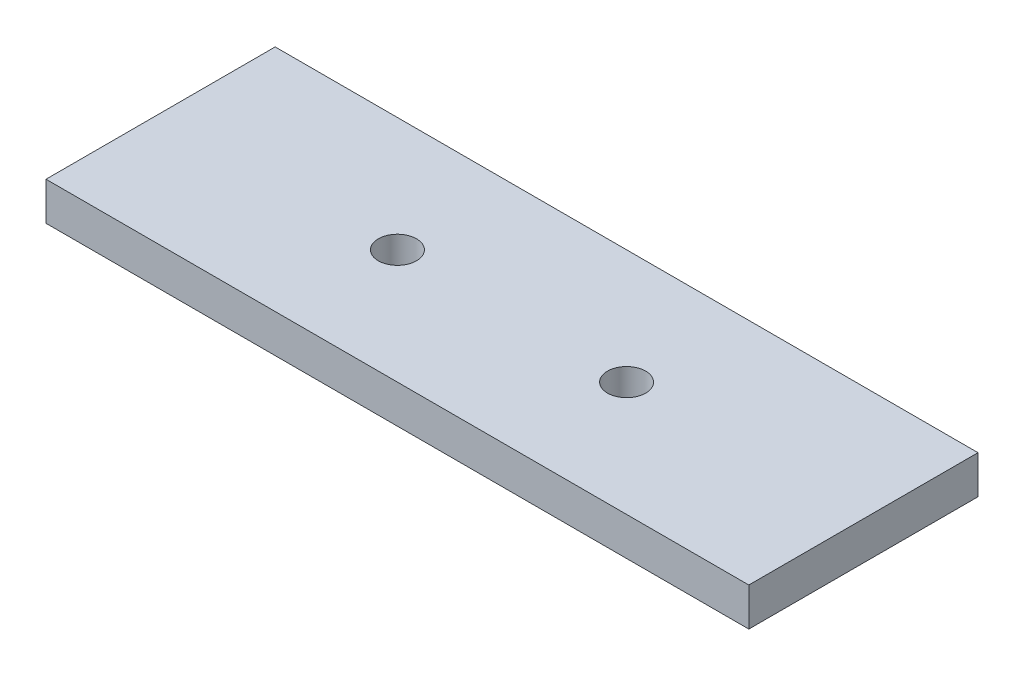
ISO-10303-21;
HEADER;
FILE_DESCRIPTION(('STEP AP214'),'2;1');
FILE_NAME('part.step','',(''),(''),'','','');
FILE_SCHEMA(('AUTOMOTIVE_DESIGN { 1 0 10303 214 1 1 1 1 }'));
ENDSEC;
DATA;
#1=APPLICATION_CONTEXT('core data for automotive mechanical design processes');
#2=APPLICATION_PROTOCOL_DEFINITION('international standard','automotive_design',2000,#1);
#3=PRODUCT_CONTEXT('',#1,'mechanical');
#4=PRODUCT('Part','Part','',(#3));
#5=PRODUCT_RELATED_PRODUCT_CATEGORY('part','',(#4));
#6=PRODUCT_DEFINITION_FORMATION('','',#4);
#7=PRODUCT_DEFINITION_CONTEXT('part definition',#1,'design');
#8=PRODUCT_DEFINITION('design','',#6,#7);
#9=PRODUCT_DEFINITION_SHAPE('','',#8);
#10=(LENGTH_UNIT() NAMED_UNIT(*) SI_UNIT(.MILLI.,.METRE.));
#11=(NAMED_UNIT(*) PLANE_ANGLE_UNIT() SI_UNIT($,.RADIAN.));
#12=(NAMED_UNIT(*) SI_UNIT($,.STERADIAN.) SOLID_ANGLE_UNIT());
#13=UNCERTAINTY_MEASURE_WITH_UNIT(LENGTH_MEASURE(1.E-05),#10,'distance_accuracy_value','');
#14=(GEOMETRIC_REPRESENTATION_CONTEXT(3) GLOBAL_UNCERTAINTY_ASSIGNED_CONTEXT((#13)) GLOBAL_UNIT_ASSIGNED_CONTEXT((#10,
#11,#12)) REPRESENTATION_CONTEXT('',''));
#15=CARTESIAN_POINT('',(0.,0.,0.));
#16=DIRECTION('',(0.,0.,1.));
#17=DIRECTION('',(1.,0.,0.));
#18=AXIS2_PLACEMENT_3D('',#15,#16,#17);
#19=CARTESIAN_POINT('',(46.,5.,15.));
#20=DIRECTION('',(-1.,0.,0.));
#21=DIRECTION('',(0.,0.,1.));
#22=AXIS2_PLACEMENT_3D('',#19,#20,#21);
#23=PLANE('',#22);
#24=DIRECTION('',(0.,0.,-1.));
#25=VECTOR('',#24,1.);
#26=CARTESIAN_POINT('',(46.,0.,15.));
#27=LINE('',#26,#25);
#28=CARTESIAN_POINT('',(46.,0.,15.));
#29=VERTEX_POINT('',#28);
#30=CARTESIAN_POINT('',(46.,0.,-15.));
#31=VERTEX_POINT('',#30);
#32=EDGE_CURVE('E95',#29,#31,#27,.T.);
#33=ORIENTED_EDGE('',*,*,#32,.T.);
#34=DIRECTION('',(0.,-1.,0.));
#35=VECTOR('',#34,1.);
#36=CARTESIAN_POINT('',(46.,5.,-15.));
#37=LINE('',#36,#35);
#38=CARTESIAN_POINT('',(46.,5.,-15.));
#39=VERTEX_POINT('',#38);
#40=EDGE_CURVE('E11',#39,#31,#37,.T.);
#41=ORIENTED_EDGE('',*,*,#40,.F.);
#42=DIRECTION('',(0.,0.,-1.));
#43=VECTOR('',#42,1.);
#44=CARTESIAN_POINT('',(46.,5.,15.));
#45=LINE('',#44,#43);
#46=CARTESIAN_POINT('',(46.,5.,15.));
#47=VERTEX_POINT('',#46);
#48=EDGE_CURVE('E83',#47,#39,#45,.T.);
#49=ORIENTED_EDGE('',*,*,#48,.F.);
#50=DIRECTION('',(0.,-1.,0.));
#51=VECTOR('',#50,1.);
#52=CARTESIAN_POINT('',(46.,5.,15.));
#53=LINE('',#52,#51);
#54=EDGE_CURVE('E91',#47,#29,#53,.T.);
#55=ORIENTED_EDGE('',*,*,#54,.T.);
#56=EDGE_LOOP('',(#33,#41,#49,#55));
#57=FACE_BOUND('',#56,.T.);
#58=ADVANCED_FACE('F32',(#57),#23,.F.);
#59=CARTESIAN_POINT('',(-46.,5.,-15.));
#60=DIRECTION('',(0.,0.,1.));
#61=DIRECTION('',(1.,0.,0.));
#62=AXIS2_PLACEMENT_3D('',#59,#60,#61);
#63=PLANE('',#62);
#64=DIRECTION('',(-1.,0.,0.));
#65=VECTOR('',#64,1.);
#66=CARTESIAN_POINT('',(-46.,0.,-15.));
#67=LINE('',#66,#65);
#68=CARTESIAN_POINT('',(-46.,0.,-15.));
#69=VERTEX_POINT('',#68);
#70=EDGE_CURVE('E87',#31,#69,#67,.T.);
#71=ORIENTED_EDGE('',*,*,#70,.T.);
#72=DIRECTION('',(0.,-1.,0.));
#73=VECTOR('',#72,1.);
#74=CARTESIAN_POINT('',(-46.,5.,-15.));
#75=LINE('',#74,#73);
#76=CARTESIAN_POINT('',(-46.,5.,-15.));
#77=VERTEX_POINT('',#76);
#78=EDGE_CURVE('E40',#77,#69,#75,.T.);
#79=ORIENTED_EDGE('',*,*,#78,.F.);
#80=DIRECTION('',(-1.,0.,0.));
#81=VECTOR('',#80,1.);
#82=CARTESIAN_POINT('',(-46.,5.,-15.));
#83=LINE('',#82,#81);
#84=EDGE_CURVE('E78',#39,#77,#83,.T.);
#85=ORIENTED_EDGE('',*,*,#84,.F.);
#86=ORIENTED_EDGE('',*,*,#40,.T.);
#87=EDGE_LOOP('',(#71,#79,#85,#86));
#88=FACE_BOUND('',#87,.T.);
#89=ADVANCED_FACE('F86',(#88),#63,.F.);
#90=CARTESIAN_POINT('',(-46.,5.,15.));
#91=DIRECTION('',(1.,0.,0.));
#92=DIRECTION('',(0.,0.,-1.));
#93=AXIS2_PLACEMENT_3D('',#90,#91,#92);
#94=PLANE('',#93);
#95=DIRECTION('',(0.,0.,1.));
#96=VECTOR('',#95,1.);
#97=CARTESIAN_POINT('',(-46.,0.,15.));
#98=LINE('',#97,#96);
#99=CARTESIAN_POINT('',(-46.,0.,15.));
#100=VERTEX_POINT('',#99);
#101=EDGE_CURVE('E65',#69,#100,#98,.T.);
#102=ORIENTED_EDGE('',*,*,#101,.T.);
#103=DIRECTION('',(0.,-1.,0.));
#104=VECTOR('',#103,1.);
#105=CARTESIAN_POINT('',(-46.,5.,15.));
#106=LINE('',#105,#104);
#107=CARTESIAN_POINT('',(-46.,5.,15.));
#108=VERTEX_POINT('',#107);
#109=EDGE_CURVE('E88',#108,#100,#106,.T.);
#110=ORIENTED_EDGE('',*,*,#109,.F.);
#111=DIRECTION('',(0.,0.,1.));
#112=VECTOR('',#111,1.);
#113=CARTESIAN_POINT('',(-46.,5.,15.));
#114=LINE('',#113,#112);
#115=EDGE_CURVE('E81',#77,#108,#114,.T.);
#116=ORIENTED_EDGE('',*,*,#115,.F.);
#117=ORIENTED_EDGE('',*,*,#78,.T.);
#118=EDGE_LOOP('',(#102,#110,#116,#117));
#119=FACE_BOUND('',#118,.T.);
#120=ADVANCED_FACE('F89',(#119),#94,.F.);
#121=CARTESIAN_POINT('',(-46.,5.,15.));
#122=DIRECTION('',(0.,0.,-1.));
#123=DIRECTION('',(-1.,0.,0.));
#124=AXIS2_PLACEMENT_3D('',#121,#122,#123);
#125=PLANE('',#124);
#126=DIRECTION('',(1.,0.,0.));
#127=VECTOR('',#126,1.);
#128=CARTESIAN_POINT('',(-46.,0.,15.));
#129=LINE('',#128,#127);
#130=EDGE_CURVE('E71',#100,#29,#129,.T.);
#131=ORIENTED_EDGE('',*,*,#130,.T.);
#132=ORIENTED_EDGE('',*,*,#54,.F.);
#133=DIRECTION('',(1.,0.,0.));
#134=VECTOR('',#133,1.);
#135=CARTESIAN_POINT('',(-46.,5.,15.));
#136=LINE('',#135,#134);
#137=EDGE_CURVE('E48',#108,#47,#136,.T.);
#138=ORIENTED_EDGE('',*,*,#137,.F.);
#139=ORIENTED_EDGE('',*,*,#109,.T.);
#140=EDGE_LOOP('',(#131,#132,#138,#139));
#141=FACE_BOUND('',#140,.T.);
#142=ADVANCED_FACE('F103',(#141),#125,.F.);
#143=CARTESIAN_POINT('',(0.,5.,0.));
#144=DIRECTION('',(0.,-1.,0.));
#145=DIRECTION('',(0.,0.,-1.));
#146=AXIS2_PLACEMENT_3D('',#143,#144,#145);
#147=PLANE('',#146);
#148=CARTESIAN_POINT('',(-15.,5.,0.));
#149=DIRECTION('',(0.,1.,0.));
#150=DIRECTION('',(0.,0.,1.));
#151=AXIS2_PLACEMENT_3D('',#148,#149,#150);
#152=CIRCLE('',#151,2.5);
#153=CARTESIAN_POINT('',(-15.,5.,2.5));
#154=VERTEX_POINT('',#153);
#155=EDGE_CURVE('E115',#154,#154,#152,.T.);
#156=ORIENTED_EDGE('',*,*,#155,.F.);
#157=EDGE_LOOP('',(#156));
#158=FACE_BOUND('',#157,.T.);
#159=CARTESIAN_POINT('',(15.,5.,0.));
#160=DIRECTION('',(0.,1.,0.));
#161=DIRECTION('',(0.,0.,1.));
#162=AXIS2_PLACEMENT_3D('',#159,#160,#161);
#163=CIRCLE('',#162,2.5);
#164=CARTESIAN_POINT('',(15.,5.,2.5));
#165=VERTEX_POINT('',#164);
#166=EDGE_CURVE('E109',#165,#165,#163,.T.);
#167=ORIENTED_EDGE('',*,*,#166,.F.);
#168=EDGE_LOOP('',(#167));
#169=FACE_BOUND('',#168,.T.);
#170=ORIENTED_EDGE('',*,*,#48,.T.);
#171=ORIENTED_EDGE('',*,*,#84,.T.);
#172=ORIENTED_EDGE('',*,*,#115,.T.);
#173=ORIENTED_EDGE('',*,*,#137,.T.);
#174=EDGE_LOOP('',(#170,#171,#172,#173));
#175=FACE_BOUND('',#174,.T.);
#176=ADVANCED_FACE('F79',(#158,#169,#175),#147,.F.);
#177=CARTESIAN_POINT('',(0.,0.,0.));
#178=DIRECTION('',(0.,-1.,0.));
#179=DIRECTION('',(0.,0.,-1.));
#180=AXIS2_PLACEMENT_3D('',#177,#178,#179);
#181=PLANE('',#180);
#182=CARTESIAN_POINT('',(-15.,0.,0.));
#183=DIRECTION('',(0.,1.,0.));
#184=DIRECTION('',(0.,0.,1.));
#185=AXIS2_PLACEMENT_3D('',#182,#183,#184);
#186=CIRCLE('',#185,2.5);
#187=CARTESIAN_POINT('',(-15.,0.,2.5));
#188=VERTEX_POINT('',#187);
#189=EDGE_CURVE('E112',#188,#188,#186,.T.);
#190=ORIENTED_EDGE('',*,*,#189,.T.);
#191=EDGE_LOOP('',(#190));
#192=FACE_BOUND('',#191,.T.);
#193=CARTESIAN_POINT('',(15.,0.,0.));
#194=DIRECTION('',(0.,1.,0.));
#195=DIRECTION('',(0.,0.,1.));
#196=AXIS2_PLACEMENT_3D('',#193,#194,#195);
#197=CIRCLE('',#196,2.5);
#198=CARTESIAN_POINT('',(15.,0.,2.5));
#199=VERTEX_POINT('',#198);
#200=EDGE_CURVE('E98',#199,#199,#197,.T.);
#201=ORIENTED_EDGE('',*,*,#200,.T.);
#202=EDGE_LOOP('',(#201));
#203=FACE_BOUND('',#202,.T.);
#204=ORIENTED_EDGE('',*,*,#32,.F.);
#205=ORIENTED_EDGE('',*,*,#130,.F.);
#206=ORIENTED_EDGE('',*,*,#101,.F.);
#207=ORIENTED_EDGE('',*,*,#70,.F.);
#208=EDGE_LOOP('',(#204,#205,#206,#207));
#209=FACE_BOUND('',#208,.T.);
#210=ADVANCED_FACE('F106',(#192,#203,#209),#181,.T.);
#211=CARTESIAN_POINT('',(15.,0.,0.));
#212=DIRECTION('',(0.,1.,0.));
#213=DIRECTION('',(0.,0.,1.));
#214=AXIS2_PLACEMENT_3D('',#211,#212,#213);
#215=CYLINDRICAL_SURFACE('',#214,2.5);
#216=ORIENTED_EDGE('',*,*,#200,.F.);
#217=EDGE_LOOP('',(#216));
#218=FACE_BOUND('',#217,.T.);
#219=ORIENTED_EDGE('',*,*,#166,.T.);
#220=EDGE_LOOP('',(#219));
#221=FACE_BOUND('',#220,.T.);
#222=ADVANCED_FACE('F126',(#218,#221),#215,.F.);
#223=CARTESIAN_POINT('',(-15.,0.,0.));
#224=DIRECTION('',(0.,1.,0.));
#225=DIRECTION('',(0.,0.,1.));
#226=AXIS2_PLACEMENT_3D('',#223,#224,#225);
#227=CYLINDRICAL_SURFACE('',#226,2.5);
#228=ORIENTED_EDGE('',*,*,#189,.F.);
#229=EDGE_LOOP('',(#228));
#230=FACE_BOUND('',#229,.T.);
#231=ORIENTED_EDGE('',*,*,#155,.T.);
#232=EDGE_LOOP('',(#231));
#233=FACE_BOUND('',#232,.T.);
#234=ADVANCED_FACE('F123',(#230,#233),#227,.F.);
#235=CLOSED_SHELL('',(#58,#89,#120,#142,#176,#210,#222,#234));
#236=MANIFOLD_SOLID_BREP('B2',#235);
#237=ADVANCED_BREP_SHAPE_REPRESENTATION('',(#18,#236),#14);
#238=SHAPE_DEFINITION_REPRESENTATION(#9,#237);
ENDSEC;
END-ISO-10303-21;
